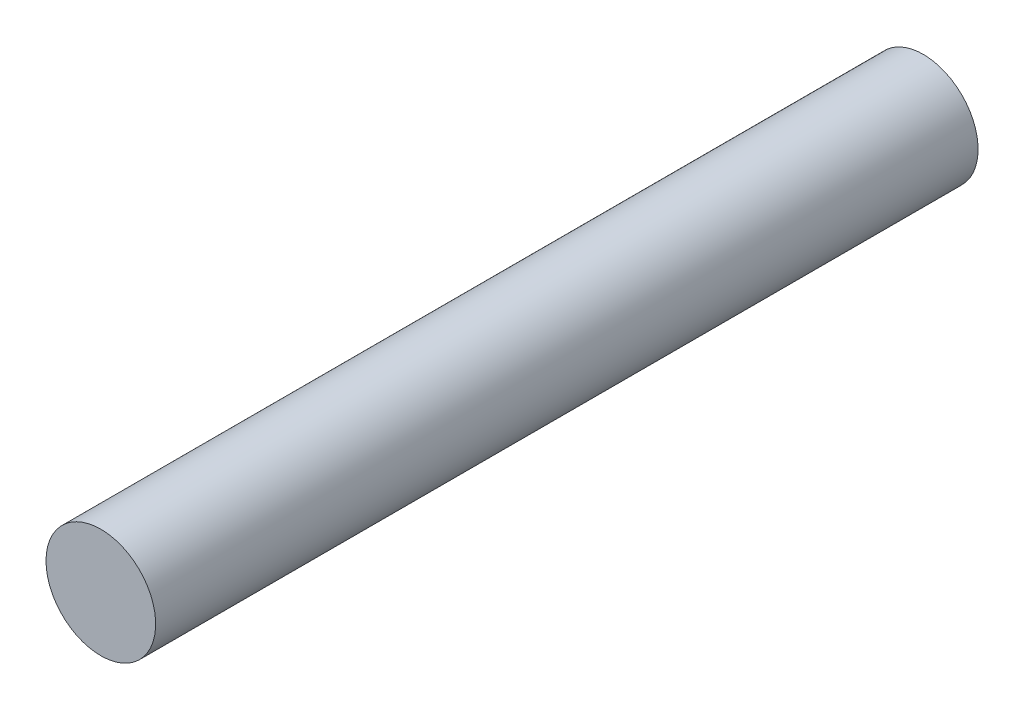
ISO-10303-21;
HEADER;
FILE_DESCRIPTION(('STEP AP214'),'2;1');
FILE_NAME('part.step','',(''),(''),'','','');
FILE_SCHEMA(('AUTOMOTIVE_DESIGN { 1 0 10303 214 1 1 1 1 }'));
ENDSEC;
DATA;
#1=APPLICATION_CONTEXT('core data for automotive mechanical design processes');
#2=APPLICATION_PROTOCOL_DEFINITION('international standard','automotive_design',2000,#1);
#3=PRODUCT_CONTEXT('',#1,'mechanical');
#4=PRODUCT('Part','Part','',(#3));
#5=PRODUCT_RELATED_PRODUCT_CATEGORY('part','',(#4));
#6=PRODUCT_DEFINITION_FORMATION('','',#4);
#7=PRODUCT_DEFINITION_CONTEXT('part definition',#1,'design');
#8=PRODUCT_DEFINITION('design','',#6,#7);
#9=PRODUCT_DEFINITION_SHAPE('','',#8);
#10=(LENGTH_UNIT() NAMED_UNIT(*) SI_UNIT(.MILLI.,.METRE.));
#11=(NAMED_UNIT(*) PLANE_ANGLE_UNIT() SI_UNIT($,.RADIAN.));
#12=(NAMED_UNIT(*) SI_UNIT($,.STERADIAN.) SOLID_ANGLE_UNIT());
#13=UNCERTAINTY_MEASURE_WITH_UNIT(LENGTH_MEASURE(1.E-05),#10,'distance_accuracy_value','');
#14=(GEOMETRIC_REPRESENTATION_CONTEXT(3) GLOBAL_UNCERTAINTY_ASSIGNED_CONTEXT((#13)) GLOBAL_UNIT_ASSIGNED_CONTEXT((#10,
#11,#12)) REPRESENTATION_CONTEXT('',''));
#15=CARTESIAN_POINT('',(0.,0.,0.));
#16=DIRECTION('',(0.,0.,1.));
#17=DIRECTION('',(1.,0.,0.));
#18=AXIS2_PLACEMENT_3D('',#15,#16,#17);
#19=CARTESIAN_POINT('',(0.,0.,90.));
#20=DIRECTION('',(0.,0.,-1.));
#21=DIRECTION('',(-1.,0.,0.));
#22=AXIS2_PLACEMENT_3D('',#19,#20,#21);
#23=CYLINDRICAL_SURFACE('',#22,6.);
#24=CARTESIAN_POINT('',(0.,0.,90.));
#25=DIRECTION('',(0.,0.,1.));
#26=DIRECTION('',(1.,0.,0.));
#27=AXIS2_PLACEMENT_3D('',#24,#25,#26);
#28=CIRCLE('',#27,6.);
#29=CARTESIAN_POINT('',(-6.,0.,90.));
#30=VERTEX_POINT('',#29);
#31=EDGE_CURVE('E10',#30,#30,#28,.T.);
#32=CARTESIAN_POINT('',(0.,0.,0.));
#33=DIRECTION('',(0.,0.,1.));
#34=DIRECTION('',(1.,0.,0.));
#35=AXIS2_PLACEMENT_3D('',#32,#33,#34);
#36=CIRCLE('',#35,6.);
#37=CARTESIAN_POINT('',(-6.,0.,0.));
#38=VERTEX_POINT('',#37);
#39=EDGE_CURVE('E34',#38,#38,#36,.T.);
#40=CARTESIAN_POINT('',(-6.,0.,90.));
#41=CARTESIAN_POINT('',(-6.,0.,89.0625));
#42=CARTESIAN_POINT('',(-6.,0.,88.125));
#43=CARTESIAN_POINT('',(-6.,0.,86.25));
#44=CARTESIAN_POINT('',(-6.,0.,85.3125));
#45=CARTESIAN_POINT('',(-6.,0.,83.4375));
#46=CARTESIAN_POINT('',(-6.,0.,82.5));
#47=CARTESIAN_POINT('',(-6.,0.,80.625));
#48=CARTESIAN_POINT('',(-6.,0.,79.6875));
#49=CARTESIAN_POINT('',(-6.,0.,77.8125));
#50=CARTESIAN_POINT('',(-6.,0.,76.875));
#51=CARTESIAN_POINT('',(-6.,0.,75.));
#52=CARTESIAN_POINT('',(-6.,0.,74.0625));
#53=CARTESIAN_POINT('',(-6.,0.,72.1875));
#54=CARTESIAN_POINT('',(-6.,0.,71.25));
#55=CARTESIAN_POINT('',(-6.,0.,69.375));
#56=CARTESIAN_POINT('',(-6.,0.,68.4375));
#57=CARTESIAN_POINT('',(-6.,0.,66.5625));
#58=CARTESIAN_POINT('',(-6.,0.,65.625));
#59=CARTESIAN_POINT('',(-6.,0.,63.75));
#60=CARTESIAN_POINT('',(-6.,0.,62.8125));
#61=CARTESIAN_POINT('',(-6.,0.,60.9375));
#62=CARTESIAN_POINT('',(-6.,0.,60.));
#63=CARTESIAN_POINT('',(-6.,0.,58.125));
#64=CARTESIAN_POINT('',(-6.,0.,57.1875));
#65=CARTESIAN_POINT('',(-6.,0.,55.3125));
#66=CARTESIAN_POINT('',(-6.,0.,54.375));
#67=CARTESIAN_POINT('',(-6.,0.,52.5));
#68=CARTESIAN_POINT('',(-6.,0.,51.5625));
#69=CARTESIAN_POINT('',(-6.,0.,49.6875));
#70=CARTESIAN_POINT('',(-6.,0.,48.75));
#71=CARTESIAN_POINT('',(-6.,0.,46.875));
#72=CARTESIAN_POINT('',(-6.,0.,45.9375));
#73=CARTESIAN_POINT('',(-6.,0.,44.0625));
#74=CARTESIAN_POINT('',(-6.,0.,43.125));
#75=CARTESIAN_POINT('',(-6.,0.,41.25));
#76=CARTESIAN_POINT('',(-6.,0.,40.3125));
#77=CARTESIAN_POINT('',(-6.,0.,38.4375));
#78=CARTESIAN_POINT('',(-6.,0.,37.5));
#79=CARTESIAN_POINT('',(-6.,0.,35.625));
#80=CARTESIAN_POINT('',(-6.,0.,34.6875));
#81=CARTESIAN_POINT('',(-6.,0.,32.8125));
#82=CARTESIAN_POINT('',(-6.,0.,31.875));
#83=CARTESIAN_POINT('',(-6.,0.,30.));
#84=CARTESIAN_POINT('',(-6.,0.,29.0625));
#85=CARTESIAN_POINT('',(-6.,0.,27.1875));
#86=CARTESIAN_POINT('',(-6.,0.,26.25));
#87=CARTESIAN_POINT('',(-6.,0.,24.375));
#88=CARTESIAN_POINT('',(-6.,0.,23.4375));
#89=CARTESIAN_POINT('',(-6.,0.,21.5625));
#90=CARTESIAN_POINT('',(-6.,0.,20.625));
#91=CARTESIAN_POINT('',(-6.,0.,18.75));
#92=CARTESIAN_POINT('',(-6.,0.,17.8125));
#93=CARTESIAN_POINT('',(-6.,0.,15.9375));
#94=CARTESIAN_POINT('',(-6.,0.,15.));
#95=CARTESIAN_POINT('',(-6.,0.,13.125));
#96=CARTESIAN_POINT('',(-6.,0.,12.1875));
#97=CARTESIAN_POINT('',(-6.,0.,10.3125));
#98=CARTESIAN_POINT('',(-6.,0.,9.37499999999999));
#99=CARTESIAN_POINT('',(-6.,0.,7.49999999999999));
#100=CARTESIAN_POINT('',(-6.,0.,6.56249999999999));
#101=CARTESIAN_POINT('',(-6.,0.,4.68749999999999));
#102=CARTESIAN_POINT('',(-6.,0.,3.74999999999998));
#103=CARTESIAN_POINT('',(-6.,0.,1.87499999999998));
#104=CARTESIAN_POINT('',(-6.,0.,0.937499999999986));
#105=CARTESIAN_POINT('',(-6.,0.,0.));
#106=B_SPLINE_CURVE_WITH_KNOTS('',3,(#40,#41,#42,#43,#44,#45,#46,#47,#48,#49,#50,#51,#52,#53,
#54,#55,#56,#57,#58,#59,#60,#61,#62,#63,#64,#65,#66,#67,#68,#69,#70,#71,#72,#73,#74,#75,#76,#77,
#78,#79,#80,#81,#82,#83,#84,#85,#86,#87,#88,#89,#90,#91,#92,#93,#94,#95,#96,#97,#98,#99,#100,
#101,#102,#103,#104,#105),.UNSPECIFIED.,.F.,.F.,(4,2,2,2,2,2,2,2,2,2,2,2,2,2,2,2,2,2,2,2,2,2,2,
2,2,2,2,2,2,2,2,2,4),(0.,2.81250000000001,5.62500000000001,8.43750000000001,11.25,14.0625,
16.875,19.6875,22.5,25.3125,28.125,30.9375,33.75,36.5625,39.375,42.1875,45.,47.8125,50.625,
53.4375,56.25,59.0625,61.875,64.6875,67.5,70.3125,73.125,75.9375,78.75,81.5625,84.375,87.1875,
90.),.UNSPECIFIED.);
#107=EDGE_CURVE('BSEAM31',#30,#38,#106,.T.);
#108=ORIENTED_EDGE('',*,*,#31,.F.);
#109=ORIENTED_EDGE('',*,*,#39,.T.);
#110=ORIENTED_EDGE('',*,*,#107,.T.);
#111=ORIENTED_EDGE('',*,*,#107,.F.);
#112=EDGE_LOOP('',(#108,#110,#109,#111));
#113=FACE_BOUND('',#112,.T.);
#114=ADVANCED_FACE('F31',(#113),#23,.T.);
#115=CARTESIAN_POINT('',(0.,0.,90.));
#116=DIRECTION('',(0.,0.,1.));
#117=DIRECTION('',(1.,0.,0.));
#118=AXIS2_PLACEMENT_3D('',#115,#116,#117);
#119=PLANE('',#118);
#120=ORIENTED_EDGE('',*,*,#31,.T.);
#121=EDGE_LOOP('',(#120));
#122=FACE_BOUND('',#121,.T.);
#123=ADVANCED_FACE('F46',(#122),#119,.T.);
#124=CARTESIAN_POINT('',(0.,0.,0.));
#125=DIRECTION('',(0.,0.,1.));
#126=DIRECTION('',(1.,0.,0.));
#127=AXIS2_PLACEMENT_3D('',#124,#125,#126);
#128=PLANE('',#127);
#129=ORIENTED_EDGE('',*,*,#39,.F.);
#130=EDGE_LOOP('',(#129));
#131=FACE_BOUND('',#130,.T.);
#132=ADVANCED_FACE('F44',(#131),#128,.F.);
#133=CLOSED_SHELL('',(#114,#123,#132));
#134=MANIFOLD_SOLID_BREP('B2',#133);
#135=ADVANCED_BREP_SHAPE_REPRESENTATION('',(#18,#134),#14);
#136=SHAPE_DEFINITION_REPRESENTATION(#9,#135);
ENDSEC;
END-ISO-10303-21;
